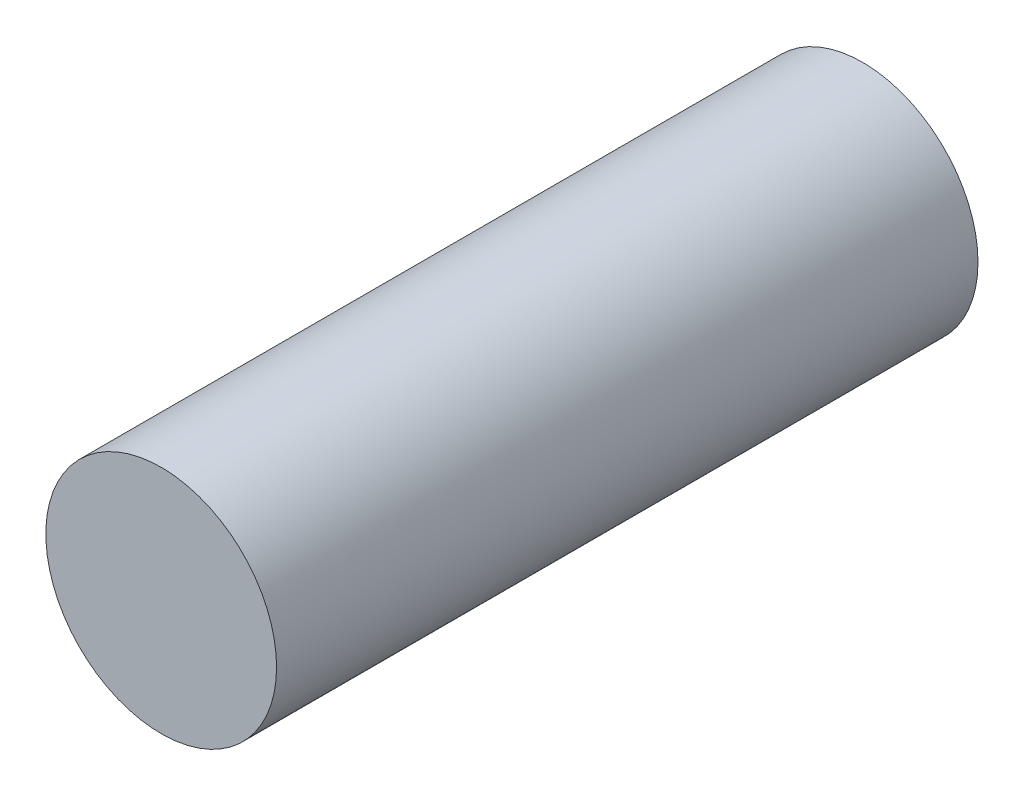
ISO-10303-21;
HEADER;
FILE_DESCRIPTION(('STEP AP214'),'2;1');
FILE_NAME('part.step','',(''),(''),'','','');
FILE_SCHEMA(('AUTOMOTIVE_DESIGN { 1 0 10303 214 1 1 1 1 }'));
ENDSEC;
DATA;
#1=APPLICATION_CONTEXT('core data for automotive mechanical design processes');
#2=APPLICATION_PROTOCOL_DEFINITION('international standard','automotive_design',2000,#1);
#3=PRODUCT_CONTEXT('',#1,'mechanical');
#4=PRODUCT('Part','Part','',(#3));
#5=PRODUCT_RELATED_PRODUCT_CATEGORY('part','',(#4));
#6=PRODUCT_DEFINITION_FORMATION('','',#4);
#7=PRODUCT_DEFINITION_CONTEXT('part definition',#1,'design');
#8=PRODUCT_DEFINITION('design','',#6,#7);
#9=PRODUCT_DEFINITION_SHAPE('','',#8);
#10=(LENGTH_UNIT() NAMED_UNIT(*) SI_UNIT(.MILLI.,.METRE.));
#11=(NAMED_UNIT(*) PLANE_ANGLE_UNIT() SI_UNIT($,.RADIAN.));
#12=(NAMED_UNIT(*) SI_UNIT($,.STERADIAN.) SOLID_ANGLE_UNIT());
#13=UNCERTAINTY_MEASURE_WITH_UNIT(LENGTH_MEASURE(1.E-05),#10,'distance_accuracy_value','');
#14=(GEOMETRIC_REPRESENTATION_CONTEXT(3) GLOBAL_UNCERTAINTY_ASSIGNED_CONTEXT((#13)) GLOBAL_UNIT_ASSIGNED_CONTEXT((#10,
#11,#12)) REPRESENTATION_CONTEXT('',''));
#15=CARTESIAN_POINT('',(0.,0.,0.));
#16=DIRECTION('',(0.,0.,1.));
#17=DIRECTION('',(1.,0.,0.));
#18=AXIS2_PLACEMENT_3D('',#15,#16,#17);
#19=CARTESIAN_POINT('',(-2.70436863865969,8.38641933280665,0.76));
#20=DIRECTION('',(0.,0.,-1.));
#21=DIRECTION('',(-1.,0.,0.));
#22=AXIS2_PLACEMENT_3D('',#19,#20,#21);
#23=CYLINDRICAL_SURFACE('',#22,0.250000000000008);
#24=CARTESIAN_POINT('',(-2.70436863865969,8.38641933280665,0.76));
#25=DIRECTION('',(0.,0.,1.));
#26=DIRECTION('',(1.,0.,0.));
#27=AXIS2_PLACEMENT_3D('',#24,#25,#26);
#28=CIRCLE('',#27,0.250000000000008);
#29=CARTESIAN_POINT('',(-2.45436863865969,8.38641933280665,0.76));
#30=VERTEX_POINT('',#29);
#31=EDGE_CURVE('E10',#30,#30,#28,.T.);
#32=ORIENTED_EDGE('',*,*,#31,.F.);
#33=EDGE_LOOP('',(#32));
#34=FACE_BOUND('',#33,.T.);
#35=CARTESIAN_POINT('',(-2.70436863865969,8.38641933280665,-0.76));
#36=DIRECTION('',(0.,0.,1.));
#37=DIRECTION('',(1.,0.,0.));
#38=AXIS2_PLACEMENT_3D('',#35,#36,#37);
#39=CIRCLE('',#38,0.250000000000008);
#40=CARTESIAN_POINT('',(-2.45436863865969,8.38641933280665,-0.76));
#41=VERTEX_POINT('',#40);
#42=EDGE_CURVE('E36',#41,#41,#39,.T.);
#43=ORIENTED_EDGE('',*,*,#42,.T.);
#44=EDGE_LOOP('',(#43));
#45=FACE_BOUND('',#44,.T.);
#46=ADVANCED_FACE('F33',(#34,#45),#23,.T.);
#47=CARTESIAN_POINT('',(-2.70436863865969,8.38641933280665,0.76));
#48=DIRECTION('',(0.,0.,1.));
#49=DIRECTION('',(1.,0.,0.));
#50=AXIS2_PLACEMENT_3D('',#47,#48,#49);
#51=PLANE('',#50);
#52=ORIENTED_EDGE('',*,*,#31,.T.);
#53=EDGE_LOOP('',(#52));
#54=FACE_BOUND('',#53,.T.);
#55=ADVANCED_FACE('F48',(#54),#51,.T.);
#56=CARTESIAN_POINT('',(-2.70436863865969,8.38641933280665,-0.76));
#57=DIRECTION('',(0.,0.,1.));
#58=DIRECTION('',(1.,0.,0.));
#59=AXIS2_PLACEMENT_3D('',#56,#57,#58);
#60=PLANE('',#59);
#61=ORIENTED_EDGE('',*,*,#42,.F.);
#62=EDGE_LOOP('',(#61));
#63=FACE_BOUND('',#62,.T.);
#64=ADVANCED_FACE('F46',(#63),#60,.F.);
#65=CLOSED_SHELL('',(#46,#55,#64));
#66=MANIFOLD_SOLID_BREP('B2',#65);
#67=ADVANCED_BREP_SHAPE_REPRESENTATION('',(#18,#66),#14);
#68=SHAPE_DEFINITION_REPRESENTATION(#9,#67);
ENDSEC;
END-ISO-10303-21;
